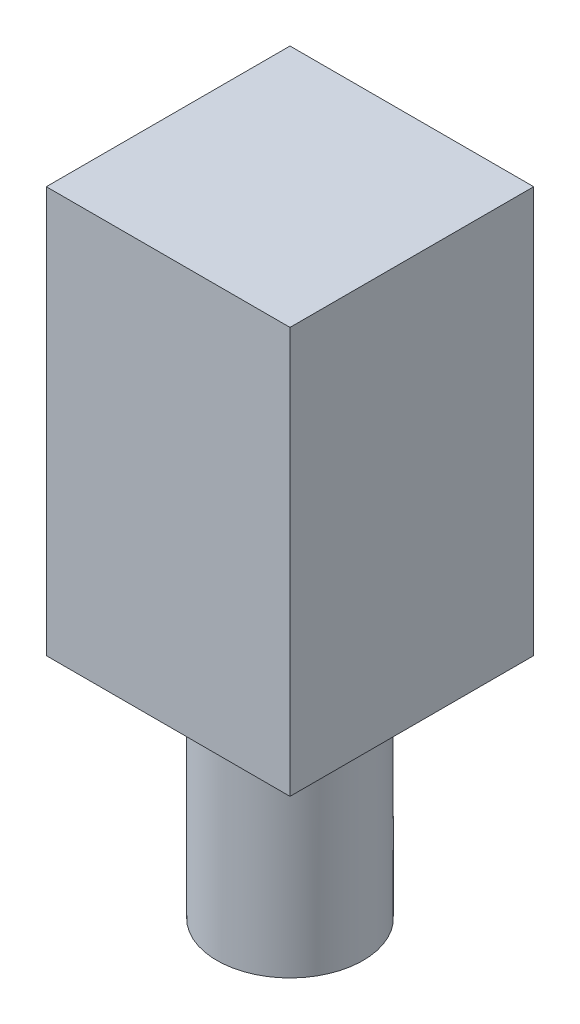
ISO-10303-21;
HEADER;
FILE_DESCRIPTION(('STEP AP214'),'2;1');
FILE_NAME('part.step','',(''),(''),'','','');
FILE_SCHEMA(('AUTOMOTIVE_DESIGN { 1 0 10303 214 1 1 1 1 }'));
ENDSEC;
DATA;
#1=APPLICATION_CONTEXT('core data for automotive mechanical design processes');
#2=APPLICATION_PROTOCOL_DEFINITION('international standard','automotive_design',2000,#1);
#3=PRODUCT_CONTEXT('',#1,'mechanical');
#4=PRODUCT('Part','Part','',(#3));
#5=PRODUCT_RELATED_PRODUCT_CATEGORY('part','',(#4));
#6=PRODUCT_DEFINITION_FORMATION('','',#4);
#7=PRODUCT_DEFINITION_CONTEXT('part definition',#1,'design');
#8=PRODUCT_DEFINITION('design','',#6,#7);
#9=PRODUCT_DEFINITION_SHAPE('','',#8);
#10=(LENGTH_UNIT() NAMED_UNIT(*) SI_UNIT(.MILLI.,.METRE.));
#11=(NAMED_UNIT(*) PLANE_ANGLE_UNIT() SI_UNIT($,.RADIAN.));
#12=(NAMED_UNIT(*) SI_UNIT($,.STERADIAN.) SOLID_ANGLE_UNIT());
#13=UNCERTAINTY_MEASURE_WITH_UNIT(LENGTH_MEASURE(1.E-05),#10,'distance_accuracy_value','');
#14=(GEOMETRIC_REPRESENTATION_CONTEXT(3) GLOBAL_UNCERTAINTY_ASSIGNED_CONTEXT((#13)) GLOBAL_UNIT_ASSIGNED_CONTEXT((#10,
#11,#12)) REPRESENTATION_CONTEXT('',''));
#15=CARTESIAN_POINT('',(0.,0.,0.));
#16=DIRECTION('',(0.,0.,1.));
#17=DIRECTION('',(1.,0.,0.));
#18=AXIS2_PLACEMENT_3D('',#15,#16,#17);
#19=CARTESIAN_POINT('',(1.5,0.,-4.));
#20=DIRECTION('',(0.,0.,1.));
#21=DIRECTION('',(1.,0.,0.));
#22=AXIS2_PLACEMENT_3D('',#19,#20,#21);
#23=PLANE('',#22);
#24=DIRECTION('',(1.,0.,0.));
#25=VECTOR('',#24,1.);
#26=CARTESIAN_POINT('',(-8.5,5.,-4.));
#27=LINE('',#26,#25);
#28=CARTESIAN_POINT('',(-1.5,5.,-4.));
#29=VERTEX_POINT('',#28);
#30=CARTESIAN_POINT('',(1.5,5.,-4.));
#31=VERTEX_POINT('',#30);
#32=EDGE_CURVE('E58',#29,#31,#27,.T.);
#33=ORIENTED_EDGE('',*,*,#32,.T.);
#34=DIRECTION('',(0.,1.,0.));
#35=VECTOR('',#34,1.);
#36=CARTESIAN_POINT('',(1.5,0.,-4.));
#37=LINE('',#36,#35);
#38=CARTESIAN_POINT('',(1.5,0.,-4.));
#39=VERTEX_POINT('',#38);
#40=EDGE_CURVE('E98',#39,#31,#37,.T.);
#41=ORIENTED_EDGE('',*,*,#40,.F.);
#42=DIRECTION('',(-1.,0.,0.));
#43=VECTOR('',#42,1.);
#44=CARTESIAN_POINT('',(1.5,0.,-4.));
#45=LINE('',#44,#43);
#46=CARTESIAN_POINT('',(-1.5,0.,-4.));
#47=VERTEX_POINT('',#46);
#48=EDGE_CURVE('E90',#39,#47,#45,.T.);
#49=ORIENTED_EDGE('',*,*,#48,.T.);
#50=DIRECTION('',(0.,1.,0.));
#51=VECTOR('',#50,1.);
#52=CARTESIAN_POINT('',(-1.5,0.,-4.));
#53=LINE('',#52,#51);
#54=EDGE_CURVE('E64',#47,#29,#53,.T.);
#55=ORIENTED_EDGE('',*,*,#54,.T.);
#56=EDGE_LOOP('',(#33,#41,#49,#55));
#57=FACE_BOUND('',#56,.T.);
#58=ADVANCED_FACE('F43',(#57),#23,.F.);
#59=CARTESIAN_POINT('',(1.5,0.,-1.));
#60=DIRECTION('',(0.,0.,1.));
#61=DIRECTION('',(1.,0.,0.));
#62=AXIS2_PLACEMENT_3D('',#59,#60,#61);
#63=PLANE('',#62);
#64=DIRECTION('',(0.,1.,0.));
#65=VECTOR('',#64,1.);
#66=CARTESIAN_POINT('',(1.5,0.,-1.));
#67=LINE('',#66,#65);
#68=CARTESIAN_POINT('',(1.5,0.,-1.));
#69=VERTEX_POINT('',#68);
#70=CARTESIAN_POINT('',(1.5,5.,-1.));
#71=VERTEX_POINT('',#70);
#72=EDGE_CURVE('E97',#69,#71,#67,.T.);
#73=ORIENTED_EDGE('',*,*,#72,.T.);
#74=DIRECTION('',(1.,0.,0.));
#75=VECTOR('',#74,1.);
#76=CARTESIAN_POINT('',(-8.5,5.,-1.));
#77=LINE('',#76,#75);
#78=CARTESIAN_POINT('',(-1.5,5.,-1.));
#79=VERTEX_POINT('',#78);
#80=EDGE_CURVE('E82',#79,#71,#77,.T.);
#81=ORIENTED_EDGE('',*,*,#80,.F.);
#82=DIRECTION('',(0.,1.,0.));
#83=VECTOR('',#82,1.);
#84=CARTESIAN_POINT('',(-1.5,0.,-1.));
#85=LINE('',#84,#83);
#86=CARTESIAN_POINT('',(-1.5,0.,-1.));
#87=VERTEX_POINT('',#86);
#88=EDGE_CURVE('E115',#87,#79,#85,.T.);
#89=ORIENTED_EDGE('',*,*,#88,.F.);
#90=DIRECTION('',(-1.,0.,0.));
#91=VECTOR('',#90,1.);
#92=CARTESIAN_POINT('',(1.5,0.,-1.));
#93=LINE('',#92,#91);
#94=EDGE_CURVE('E51',#69,#87,#93,.T.);
#95=ORIENTED_EDGE('',*,*,#94,.F.);
#96=EDGE_LOOP('',(#73,#81,#89,#95));
#97=FACE_BOUND('',#96,.T.);
#98=ADVANCED_FACE('F45',(#97),#63,.T.);
#99=CARTESIAN_POINT('',(1.5,0.,0.));
#100=DIRECTION('',(0.,1.,0.));
#101=DIRECTION('',(0.,0.,1.));
#102=AXIS2_PLACEMENT_3D('',#99,#100,#101);
#103=PLANE('',#102);
#104=ORIENTED_EDGE('',*,*,#48,.F.);
#105=DIRECTION('',(0.,0.,-1.));
#106=VECTOR('',#105,1.);
#107=CARTESIAN_POINT('',(1.5,0.,0.));
#108=LINE('',#107,#106);
#109=EDGE_CURVE('E102',#69,#39,#108,.T.);
#110=ORIENTED_EDGE('',*,*,#109,.F.);
#111=ORIENTED_EDGE('',*,*,#94,.T.);
#112=DIRECTION('',(0.,0.,-1.));
#113=VECTOR('',#112,1.);
#114=CARTESIAN_POINT('',(-1.5,0.,0.));
#115=LINE('',#114,#113);
#116=EDGE_CURVE('E105',#87,#47,#115,.T.);
#117=ORIENTED_EDGE('',*,*,#116,.T.);
#118=EDGE_LOOP('',(#104,#110,#111,#117));
#119=FACE_BOUND('',#118,.T.);
#120=CARTESIAN_POINT('',(0.,0.,-2.5));
#121=DIRECTION('',(0.,1.,0.));
#122=DIRECTION('',(0.,0.,1.));
#123=AXIS2_PLACEMENT_3D('',#120,#121,#122);
#124=CIRCLE('',#123,0.9);
#125=CARTESIAN_POINT('',(0.,0.,-1.6));
#126=VERTEX_POINT('',#125);
#127=EDGE_CURVE('E99',#126,#126,#124,.F.);
#128=ORIENTED_EDGE('',*,*,#127,.F.);
#129=EDGE_LOOP('',(#128));
#130=FACE_BOUND('',#129,.T.);
#131=ADVANCED_FACE('F112',(#119,#130),#103,.F.);
#132=CARTESIAN_POINT('',(1.5,0.,0.));
#133=DIRECTION('',(1.,0.,0.));
#134=DIRECTION('',(0.,0.,-1.));
#135=AXIS2_PLACEMENT_3D('',#132,#133,#134);
#136=PLANE('',#135);
#137=ORIENTED_EDGE('',*,*,#109,.T.);
#138=ORIENTED_EDGE('',*,*,#40,.T.);
#139=DIRECTION('',(0.,0.,1.));
#140=VECTOR('',#139,1.);
#141=CARTESIAN_POINT('',(1.5,5.,-4.));
#142=LINE('',#141,#140);
#143=EDGE_CURVE('E85',#31,#71,#142,.T.);
#144=ORIENTED_EDGE('',*,*,#143,.T.);
#145=ORIENTED_EDGE('',*,*,#72,.F.);
#146=EDGE_LOOP('',(#137,#138,#144,#145));
#147=FACE_BOUND('',#146,.T.);
#148=ADVANCED_FACE('F96',(#147),#136,.T.);
#149=CARTESIAN_POINT('',(-1.5,0.,0.));
#150=DIRECTION('',(-1.,0.,0.));
#151=DIRECTION('',(0.,0.,-1.));
#152=AXIS2_PLACEMENT_3D('',#149,#150,#151);
#153=PLANE('',#152);
#154=ORIENTED_EDGE('',*,*,#54,.F.);
#155=ORIENTED_EDGE('',*,*,#116,.F.);
#156=ORIENTED_EDGE('',*,*,#88,.T.);
#157=DIRECTION('',(0.,0.,-1.));
#158=VECTOR('',#157,1.);
#159=CARTESIAN_POINT('',(-1.5,5.,0.));
#160=LINE('',#159,#158);
#161=EDGE_CURVE('E12',#79,#29,#160,.T.);
#162=ORIENTED_EDGE('',*,*,#161,.T.);
#163=EDGE_LOOP('',(#154,#155,#156,#162));
#164=FACE_BOUND('',#163,.T.);
#165=ADVANCED_FACE('F114',(#164),#153,.T.);
#166=CARTESIAN_POINT('',(-8.5,5.,-4.));
#167=DIRECTION('',(0.,1.,0.));
#168=DIRECTION('',(0.,0.,1.));
#169=AXIS2_PLACEMENT_3D('',#166,#167,#168);
#170=PLANE('',#169);
#171=ORIENTED_EDGE('',*,*,#80,.T.);
#172=ORIENTED_EDGE('',*,*,#143,.F.);
#173=ORIENTED_EDGE('',*,*,#32,.F.);
#174=ORIENTED_EDGE('',*,*,#161,.F.);
#175=EDGE_LOOP('',(#171,#172,#173,#174));
#176=FACE_BOUND('',#175,.T.);
#177=ADVANCED_FACE('F84',(#176),#170,.T.);
#178=CARTESIAN_POINT('',(0.,4.38406204335659,-2.5));
#179=DIRECTION('',(0.,-1.,0.));
#180=DIRECTION('',(0.,0.,-1.));
#181=AXIS2_PLACEMENT_3D('',#178,#179,#180);
#182=CYLINDRICAL_SURFACE('',#181,0.9);
#183=CARTESIAN_POINT('',(0.,-2.8,-2.5));
#184=DIRECTION('',(0.,-1.,0.));
#185=DIRECTION('',(0.,0.,-1.));
#186=AXIS2_PLACEMENT_3D('',#183,#184,#185);
#187=CIRCLE('',#186,0.9);
#188=CARTESIAN_POINT('',(0.,-2.8,-3.4));
#189=VERTEX_POINT('',#188);
#190=EDGE_CURVE('E122',#189,#189,#187,.T.);
#191=ORIENTED_EDGE('',*,*,#190,.F.);
#192=EDGE_LOOP('',(#191));
#193=FACE_BOUND('',#192,.T.);
#194=ORIENTED_EDGE('',*,*,#127,.T.);
#195=EDGE_LOOP('',(#194));
#196=FACE_BOUND('',#195,.T.);
#197=ADVANCED_FACE('F128',(#193,#196),#182,.T.);
#198=CARTESIAN_POINT('',(0.,-2.8,-2.5));
#199=DIRECTION('',(0.,1.,0.));
#200=DIRECTION('',(0.,0.,1.));
#201=AXIS2_PLACEMENT_3D('',#198,#199,#200);
#202=PLANE('',#201);
#203=ORIENTED_EDGE('',*,*,#190,.T.);
#204=EDGE_LOOP('',(#203));
#205=FACE_BOUND('',#204,.T.);
#206=ADVANCED_FACE('F126',(#205),#202,.F.);
#207=CLOSED_SHELL('',(#58,#98,#131,#148,#165,#177,#197,#206));
#208=MANIFOLD_SOLID_BREP('B2',#207);
#209=ADVANCED_BREP_SHAPE_REPRESENTATION('',(#18,#208),#14);
#210=SHAPE_DEFINITION_REPRESENTATION(#9,#209);
ENDSEC;
END-ISO-10303-21;
